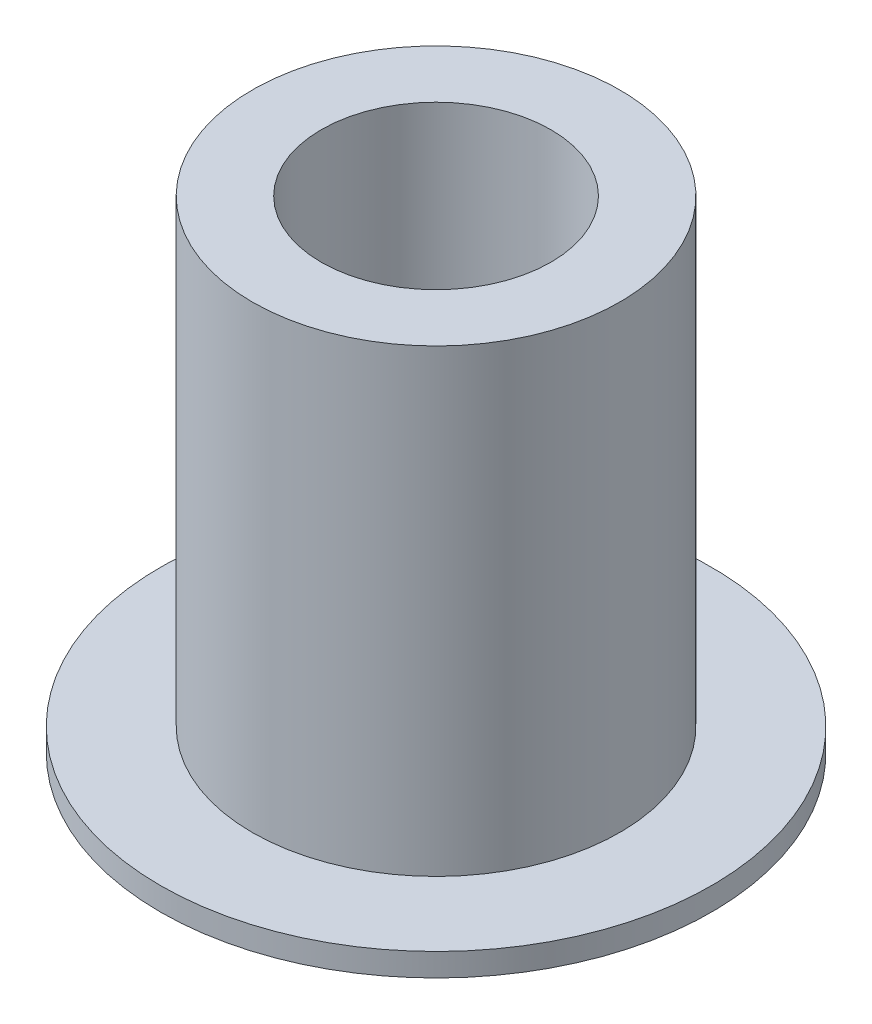
ISO-10303-21;
HEADER;
FILE_DESCRIPTION(('STEP AP214'),'2;1');
FILE_NAME('part.step','',(''),(''),'','','');
FILE_SCHEMA(('AUTOMOTIVE_DESIGN { 1 0 10303 214 1 1 1 1 }'));
ENDSEC;
DATA;
#1=APPLICATION_CONTEXT('core data for automotive mechanical design processes');
#2=APPLICATION_PROTOCOL_DEFINITION('international standard','automotive_design',2000,#1);
#3=PRODUCT_CONTEXT('',#1,'mechanical');
#4=PRODUCT('Part','Part','',(#3));
#5=PRODUCT_RELATED_PRODUCT_CATEGORY('part','',(#4));
#6=PRODUCT_DEFINITION_FORMATION('','',#4);
#7=PRODUCT_DEFINITION_CONTEXT('part definition',#1,'design');
#8=PRODUCT_DEFINITION('design','',#6,#7);
#9=PRODUCT_DEFINITION_SHAPE('','',#8);
#10=(LENGTH_UNIT() NAMED_UNIT(*) SI_UNIT(.MILLI.,.METRE.));
#11=(NAMED_UNIT(*) PLANE_ANGLE_UNIT() SI_UNIT($,.RADIAN.));
#12=(NAMED_UNIT(*) SI_UNIT($,.STERADIAN.) SOLID_ANGLE_UNIT());
#13=UNCERTAINTY_MEASURE_WITH_UNIT(LENGTH_MEASURE(1.E-05),#10,'distance_accuracy_value','');
#14=(GEOMETRIC_REPRESENTATION_CONTEXT(3) GLOBAL_UNCERTAINTY_ASSIGNED_CONTEXT((#13)) GLOBAL_UNIT_ASSIGNED_CONTEXT((#10,
#11,#12)) REPRESENTATION_CONTEXT('',''));
#15=CARTESIAN_POINT('',(0.,0.,0.));
#16=DIRECTION('',(0.,0.,1.));
#17=DIRECTION('',(1.,0.,0.));
#18=AXIS2_PLACEMENT_3D('',#15,#16,#17);
#19=CARTESIAN_POINT('',(0.,0.5,0.));
#20=DIRECTION('',(0.,-1.,0.));
#21=DIRECTION('',(0.,0.,-1.));
#22=AXIS2_PLACEMENT_3D('',#19,#20,#21);
#23=CYLINDRICAL_SURFACE('',#22,6.);
#24=CARTESIAN_POINT('',(0.,0.5,0.));
#25=DIRECTION('',(0.,1.,0.));
#26=DIRECTION('',(0.,0.,1.));
#27=AXIS2_PLACEMENT_3D('',#24,#25,#26);
#28=CIRCLE('',#27,6.);
#29=CARTESIAN_POINT('',(0.,0.5,6.));
#30=VERTEX_POINT('',#29);
#31=EDGE_CURVE('E45',#30,#30,#28,.T.);
#32=ORIENTED_EDGE('',*,*,#31,.F.);
#33=EDGE_LOOP('',(#32));
#34=FACE_BOUND('',#33,.T.);
#35=CARTESIAN_POINT('',(0.,0.,0.));
#36=DIRECTION('',(0.,1.,0.));
#37=DIRECTION('',(0.,0.,1.));
#38=AXIS2_PLACEMENT_3D('',#35,#36,#37);
#39=CIRCLE('',#38,6.);
#40=CARTESIAN_POINT('',(0.,0.,6.));
#41=VERTEX_POINT('',#40);
#42=EDGE_CURVE('E49',#41,#41,#39,.T.);
#43=ORIENTED_EDGE('',*,*,#42,.T.);
#44=EDGE_LOOP('',(#43));
#45=FACE_BOUND('',#44,.T.);
#46=ADVANCED_FACE('F39',(#34,#45),#23,.T.);
#47=CARTESIAN_POINT('',(0.,0.5,0.));
#48=DIRECTION('',(0.,1.,0.));
#49=DIRECTION('',(0.,0.,1.));
#50=AXIS2_PLACEMENT_3D('',#47,#48,#49);
#51=PLANE('',#50);
#52=CARTESIAN_POINT('',(0.,0.5,0.));
#53=DIRECTION('',(0.,1.,0.));
#54=DIRECTION('',(0.,0.,1.));
#55=AXIS2_PLACEMENT_3D('',#52,#53,#54);
#56=CIRCLE('',#55,4.);
#57=CARTESIAN_POINT('',(0.,0.5,4.));
#58=VERTEX_POINT('',#57);
#59=EDGE_CURVE('E56',#58,#58,#56,.T.);
#60=ORIENTED_EDGE('',*,*,#59,.F.);
#61=EDGE_LOOP('',(#60));
#62=FACE_BOUND('',#61,.T.);
#63=ORIENTED_EDGE('',*,*,#31,.T.);
#64=EDGE_LOOP('',(#63));
#65=FACE_BOUND('',#64,.T.);
#66=ADVANCED_FACE('F79',(#62,#65),#51,.T.);
#67=CARTESIAN_POINT('',(0.,0.,0.));
#68=DIRECTION('',(0.,1.,0.));
#69=DIRECTION('',(0.,0.,1.));
#70=AXIS2_PLACEMENT_3D('',#67,#68,#69);
#71=PLANE('',#70);
#72=ORIENTED_EDGE('',*,*,#42,.F.);
#73=EDGE_LOOP('',(#72));
#74=FACE_BOUND('',#73,.T.);
#75=ADVANCED_FACE('F70',(#74),#71,.F.);
#76=CARTESIAN_POINT('',(0.,10.5,0.));
#77=DIRECTION('',(0.,1.,0.));
#78=DIRECTION('',(0.,0.,1.));
#79=AXIS2_PLACEMENT_3D('',#76,#77,#78);
#80=PLANE('',#79);
#81=CARTESIAN_POINT('',(0.,10.5,0.));
#82=DIRECTION('',(0.,1.,0.));
#83=DIRECTION('',(0.,0.,1.));
#84=AXIS2_PLACEMENT_3D('',#81,#82,#83);
#85=CIRCLE('',#84,4.);
#86=CARTESIAN_POINT('',(0.,10.5,4.));
#87=VERTEX_POINT('',#86);
#88=EDGE_CURVE('E54',#87,#87,#85,.T.);
#89=ORIENTED_EDGE('',*,*,#88,.T.);
#90=EDGE_LOOP('',(#89));
#91=FACE_BOUND('',#90,.T.);
#92=CARTESIAN_POINT('',(0.,10.5,0.));
#93=DIRECTION('',(0.,1.,0.));
#94=DIRECTION('',(0.,0.,1.));
#95=AXIS2_PLACEMENT_3D('',#92,#93,#94);
#96=CIRCLE('',#95,2.5);
#97=CARTESIAN_POINT('',(0.,10.5,2.5));
#98=VERTEX_POINT('',#97);
#99=EDGE_CURVE('E59',#98,#98,#96,.T.);
#100=ORIENTED_EDGE('',*,*,#99,.F.);
#101=EDGE_LOOP('',(#100));
#102=FACE_BOUND('',#101,.T.);
#103=ADVANCED_FACE('F67',(#91,#102),#80,.T.);
#104=CARTESIAN_POINT('',(0.,10.5,0.));
#105=DIRECTION('',(0.,-1.,0.));
#106=DIRECTION('',(0.,0.,-1.));
#107=AXIS2_PLACEMENT_3D('',#104,#105,#106);
#108=CYLINDRICAL_SURFACE('',#107,4.);
#109=ORIENTED_EDGE('',*,*,#88,.F.);
#110=EDGE_LOOP('',(#109));
#111=FACE_BOUND('',#110,.T.);
#112=ORIENTED_EDGE('',*,*,#59,.T.);
#113=EDGE_LOOP('',(#112));
#114=FACE_BOUND('',#113,.T.);
#115=ADVANCED_FACE('F69',(#111,#114),#108,.T.);
#116=CARTESIAN_POINT('',(0.,10.5,0.));
#117=DIRECTION('',(0.,-1.,0.));
#118=DIRECTION('',(0.,0.,-1.));
#119=AXIS2_PLACEMENT_3D('',#116,#117,#118);
#120=CYLINDRICAL_SURFACE('',#119,2.5);
#121=ORIENTED_EDGE('',*,*,#99,.T.);
#122=EDGE_LOOP('',(#121));
#123=FACE_BOUND('',#122,.T.);
#124=CARTESIAN_POINT('',(0.,0.5,0.));
#125=DIRECTION('',(0.,1.,0.));
#126=DIRECTION('',(0.,0.,1.));
#127=AXIS2_PLACEMENT_3D('',#124,#125,#126);
#128=CIRCLE('',#127,2.5);
#129=CARTESIAN_POINT('',(0.,0.5,2.5));
#130=VERTEX_POINT('',#129);
#131=EDGE_CURVE('E11',#130,#130,#128,.F.);
#132=ORIENTED_EDGE('',*,*,#131,.T.);
#133=EDGE_LOOP('',(#132));
#134=FACE_BOUND('',#133,.T.);
#135=ADVANCED_FACE('F65',(#123,#134),#120,.F.);
#136=ORIENTED_EDGE('',*,*,#131,.F.);
#137=EDGE_LOOP('',(#136));
#138=FACE_BOUND('',#137,.T.);
#139=ADVANCED_FACE('F89',(#138),#51,.T.);
#140=CLOSED_SHELL('',(#46,#66,#75,#103,#115,#135,#139));
#141=MANIFOLD_SOLID_BREP('B2',#140);
#142=ADVANCED_BREP_SHAPE_REPRESENTATION('',(#18,#141),#14);
#143=SHAPE_DEFINITION_REPRESENTATION(#9,#142);
ENDSEC;
END-ISO-10303-21;
